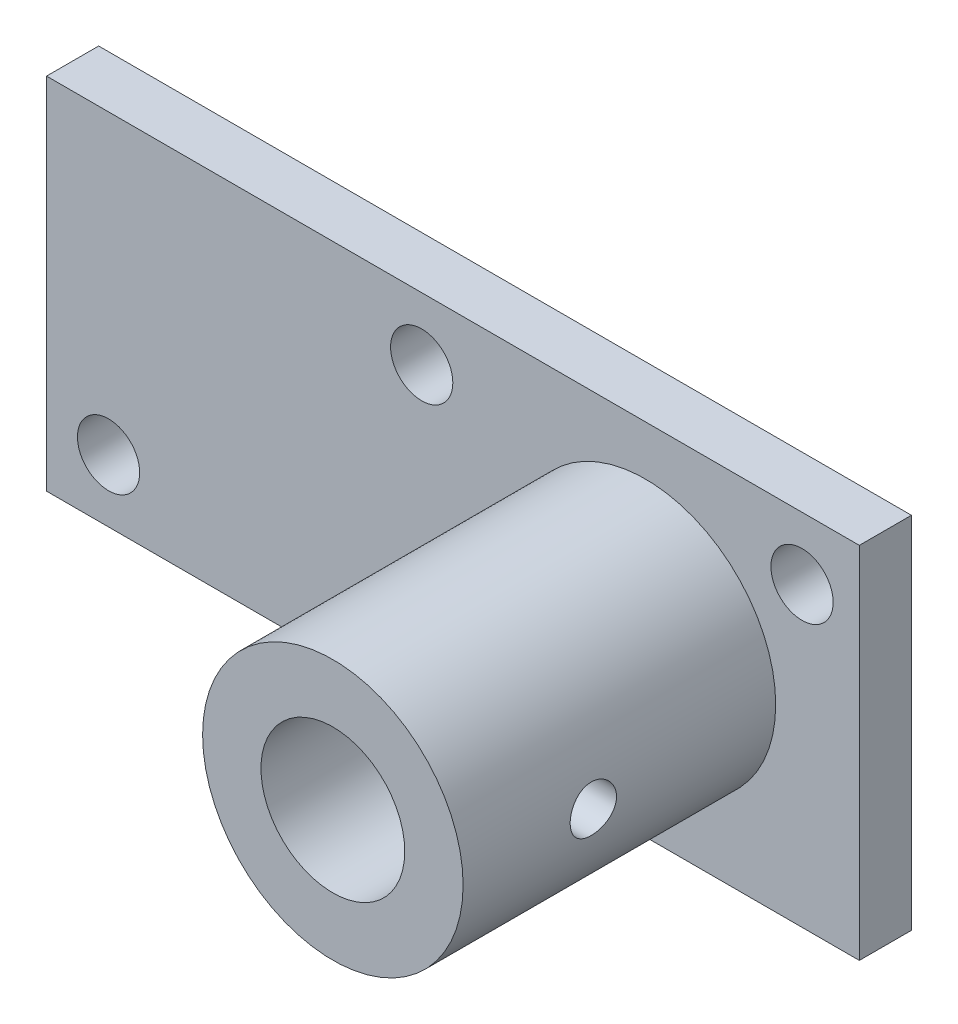
ISO-10303-21;
HEADER;
FILE_DESCRIPTION(('STEP AP214'),'2;1');
FILE_NAME('part.step','',(''),(''),'','','');
FILE_SCHEMA(('AUTOMOTIVE_DESIGN { 1 0 10303 214 1 1 1 1 }'));
ENDSEC;
DATA;
#1=APPLICATION_CONTEXT('core data for automotive mechanical design processes');
#2=APPLICATION_PROTOCOL_DEFINITION('international standard','automotive_design',2000,#1);
#3=PRODUCT_CONTEXT('',#1,'mechanical');
#4=PRODUCT('Part','Part','',(#3));
#5=PRODUCT_RELATED_PRODUCT_CATEGORY('part','',(#4));
#6=PRODUCT_DEFINITION_FORMATION('','',#4);
#7=PRODUCT_DEFINITION_CONTEXT('part definition',#1,'design');
#8=PRODUCT_DEFINITION('design','',#6,#7);
#9=PRODUCT_DEFINITION_SHAPE('','',#8);
#10=(LENGTH_UNIT() NAMED_UNIT(*) SI_UNIT(.MILLI.,.METRE.));
#11=(NAMED_UNIT(*) PLANE_ANGLE_UNIT() SI_UNIT($,.RADIAN.));
#12=(NAMED_UNIT(*) SI_UNIT($,.STERADIAN.) SOLID_ANGLE_UNIT());
#13=UNCERTAINTY_MEASURE_WITH_UNIT(LENGTH_MEASURE(1.E-05),#10,'distance_accuracy_value','');
#14=(GEOMETRIC_REPRESENTATION_CONTEXT(3) GLOBAL_UNCERTAINTY_ASSIGNED_CONTEXT((#13)) GLOBAL_UNIT_ASSIGNED_CONTEXT((#10,
#11,#12)) REPRESENTATION_CONTEXT('',''));
#15=CARTESIAN_POINT('',(0.,0.,0.));
#16=DIRECTION('',(0.,0.,1.));
#17=DIRECTION('',(1.,0.,0.));
#18=AXIS2_PLACEMENT_3D('',#15,#16,#17);
#19=CARTESIAN_POINT('',(0.,0.,2.54));
#20=DIRECTION('',(1.,0.,0.));
#21=DIRECTION('',(0.,1.,0.));
#22=AXIS2_PLACEMENT_3D('',#19,#20,#21);
#23=PLANE('',#22);
#24=DIRECTION('',(0.,-1.,0.));
#25=VECTOR('',#24,1.);
#26=CARTESIAN_POINT('',(0.,0.,0.));
#27=LINE('',#26,#25);
#28=CARTESIAN_POINT('',(0.,0.,0.));
#29=VERTEX_POINT('',#28);
#30=CARTESIAN_POINT('',(0.,-17.526,0.));
#31=VERTEX_POINT('',#30);
#32=EDGE_CURVE('E106',#29,#31,#27,.T.);
#33=ORIENTED_EDGE('',*,*,#32,.T.);
#34=DIRECTION('',(0.,0.,-1.));
#35=VECTOR('',#34,1.);
#36=CARTESIAN_POINT('',(0.,-17.526,2.54));
#37=LINE('',#36,#35);
#38=CARTESIAN_POINT('',(0.,-17.526,2.54));
#39=VERTEX_POINT('',#38);
#40=EDGE_CURVE('E11',#39,#31,#37,.T.);
#41=ORIENTED_EDGE('',*,*,#40,.F.);
#42=DIRECTION('',(0.,-1.,0.));
#43=VECTOR('',#42,1.);
#44=CARTESIAN_POINT('',(0.,0.,2.54));
#45=LINE('',#44,#43);
#46=CARTESIAN_POINT('',(0.,0.,2.54));
#47=VERTEX_POINT('',#46);
#48=EDGE_CURVE('E90',#47,#39,#45,.T.);
#49=ORIENTED_EDGE('',*,*,#48,.F.);
#50=DIRECTION('',(0.,0.,-1.));
#51=VECTOR('',#50,1.);
#52=CARTESIAN_POINT('',(0.,0.,2.54));
#53=LINE('',#52,#51);
#54=EDGE_CURVE('E102',#47,#29,#53,.T.);
#55=ORIENTED_EDGE('',*,*,#54,.T.);
#56=EDGE_LOOP('',(#33,#41,#49,#55));
#57=FACE_BOUND('',#56,.T.);
#58=ADVANCED_FACE('F38',(#57),#23,.F.);
#59=CARTESIAN_POINT('',(0.,-17.526,2.54));
#60=DIRECTION('',(0.,1.,0.));
#61=DIRECTION('',(0.,0.,1.));
#62=AXIS2_PLACEMENT_3D('',#59,#60,#61);
#63=PLANE('',#62);
#64=DIRECTION('',(1.,0.,0.));
#65=VECTOR('',#64,1.);
#66=CARTESIAN_POINT('',(0.,-17.526,0.));
#67=LINE('',#66,#65);
#68=CARTESIAN_POINT('',(39.624,-17.526,0.));
#69=VERTEX_POINT('',#68);
#70=EDGE_CURVE('E95',#31,#69,#67,.T.);
#71=ORIENTED_EDGE('',*,*,#70,.T.);
#72=DIRECTION('',(0.,0.,-1.));
#73=VECTOR('',#72,1.);
#74=CARTESIAN_POINT('',(39.624,-17.526,2.54));
#75=LINE('',#74,#73);
#76=CARTESIAN_POINT('',(39.624,-17.526,2.54));
#77=VERTEX_POINT('',#76);
#78=EDGE_CURVE('E47',#77,#69,#75,.T.);
#79=ORIENTED_EDGE('',*,*,#78,.F.);
#80=DIRECTION('',(1.,0.,0.));
#81=VECTOR('',#80,1.);
#82=CARTESIAN_POINT('',(0.,-17.526,2.54));
#83=LINE('',#82,#81);
#84=EDGE_CURVE('E85',#39,#77,#83,.T.);
#85=ORIENTED_EDGE('',*,*,#84,.F.);
#86=ORIENTED_EDGE('',*,*,#40,.T.);
#87=EDGE_LOOP('',(#71,#79,#85,#86));
#88=FACE_BOUND('',#87,.T.);
#89=ADVANCED_FACE('F94',(#88),#63,.F.);
#90=CARTESIAN_POINT('',(39.624,0.,2.54));
#91=DIRECTION('',(-1.,0.,0.));
#92=DIRECTION('',(0.,0.,1.));
#93=AXIS2_PLACEMENT_3D('',#90,#91,#92);
#94=PLANE('',#93);
#95=DIRECTION('',(0.,1.,0.));
#96=VECTOR('',#95,1.);
#97=CARTESIAN_POINT('',(39.624,0.,0.));
#98=LINE('',#97,#96);
#99=CARTESIAN_POINT('',(39.624,0.,0.));
#100=VERTEX_POINT('',#99);
#101=EDGE_CURVE('E72',#69,#100,#98,.T.);
#102=ORIENTED_EDGE('',*,*,#101,.T.);
#103=DIRECTION('',(0.,0.,-1.));
#104=VECTOR('',#103,1.);
#105=CARTESIAN_POINT('',(39.624,0.,2.54));
#106=LINE('',#105,#104);
#107=CARTESIAN_POINT('',(39.624,0.,2.54));
#108=VERTEX_POINT('',#107);
#109=EDGE_CURVE('E97',#108,#100,#106,.T.);
#110=ORIENTED_EDGE('',*,*,#109,.F.);
#111=DIRECTION('',(0.,1.,0.));
#112=VECTOR('',#111,1.);
#113=CARTESIAN_POINT('',(39.624,0.,2.54));
#114=LINE('',#113,#112);
#115=EDGE_CURVE('E88',#77,#108,#114,.T.);
#116=ORIENTED_EDGE('',*,*,#115,.F.);
#117=ORIENTED_EDGE('',*,*,#78,.T.);
#118=EDGE_LOOP('',(#102,#110,#116,#117));
#119=FACE_BOUND('',#118,.T.);
#120=ADVANCED_FACE('F98',(#119),#94,.F.);
#121=CARTESIAN_POINT('',(0.,0.,2.54));
#122=DIRECTION('',(0.,-1.,0.));
#123=DIRECTION('',(0.,0.,-1.));
#124=AXIS2_PLACEMENT_3D('',#121,#122,#123);
#125=PLANE('',#124);
#126=DIRECTION('',(-1.,0.,0.));
#127=VECTOR('',#126,1.);
#128=CARTESIAN_POINT('',(0.,0.,0.));
#129=LINE('',#128,#127);
#130=EDGE_CURVE('E78',#100,#29,#129,.T.);
#131=ORIENTED_EDGE('',*,*,#130,.T.);
#132=ORIENTED_EDGE('',*,*,#54,.F.);
#133=DIRECTION('',(-1.,0.,0.));
#134=VECTOR('',#133,1.);
#135=CARTESIAN_POINT('',(0.,0.,2.54));
#136=LINE('',#135,#134);
#137=EDGE_CURVE('E55',#108,#47,#136,.T.);
#138=ORIENTED_EDGE('',*,*,#137,.F.);
#139=ORIENTED_EDGE('',*,*,#109,.T.);
#140=EDGE_LOOP('',(#131,#132,#138,#139));
#141=FACE_BOUND('',#140,.T.);
#142=ADVANCED_FACE('F120',(#141),#125,.F.);
#143=CARTESIAN_POINT('',(0.,0.,2.54));
#144=DIRECTION('',(0.,0.,1.));
#145=DIRECTION('',(1.,0.,0.));
#146=AXIS2_PLACEMENT_3D('',#143,#144,#145);
#147=PLANE('',#146);
#148=CARTESIAN_POINT('',(29.1973,-8.763,2.54));
#149=DIRECTION('',(0.,0.,1.));
#150=DIRECTION('',(1.,0.,0.));
#151=AXIS2_PLACEMENT_3D('',#148,#149,#150);
#152=CIRCLE('',#151,6.35);
#153=CARTESIAN_POINT('',(35.5473,-8.763,2.54));
#154=VERTEX_POINT('',#153);
#155=EDGE_CURVE('E159',#154,#154,#152,.T.);
#156=ORIENTED_EDGE('',*,*,#155,.F.);
#157=EDGE_LOOP('',(#156));
#158=FACE_BOUND('',#157,.T.);
#159=CARTESIAN_POINT('',(36.83,-3.048,2.54));
#160=DIRECTION('',(0.,0.,1.));
#161=DIRECTION('',(1.,0.,0.));
#162=AXIS2_PLACEMENT_3D('',#159,#160,#161);
#163=CIRCLE('',#162,1.51789784471177);
#164=CARTESIAN_POINT('',(38.3478978447118,-3.048,2.54));
#165=VERTEX_POINT('',#164);
#166=EDGE_CURVE('E152',#165,#165,#163,.T.);
#167=ORIENTED_EDGE('',*,*,#166,.F.);
#168=EDGE_LOOP('',(#167));
#169=FACE_BOUND('',#168,.T.);
#170=CARTESIAN_POINT('',(21.5646,-14.478,2.54));
#171=DIRECTION('',(0.,0.,1.));
#172=DIRECTION('',(1.,0.,0.));
#173=AXIS2_PLACEMENT_3D('',#170,#171,#172);
#174=CIRCLE('',#173,1.51789784471177);
#175=CARTESIAN_POINT('',(23.0824978447118,-14.478,2.54));
#176=VERTEX_POINT('',#175);
#177=EDGE_CURVE('E144',#176,#176,#174,.T.);
#178=ORIENTED_EDGE('',*,*,#177,.F.);
#179=EDGE_LOOP('',(#178));
#180=FACE_BOUND('',#179,.T.);
#181=CARTESIAN_POINT('',(18.288,-3.048,2.54));
#182=DIRECTION('',(0.,0.,1.));
#183=DIRECTION('',(1.,0.,0.));
#184=AXIS2_PLACEMENT_3D('',#181,#182,#183);
#185=CIRCLE('',#184,1.51789784471177);
#186=CARTESIAN_POINT('',(19.8058978447118,-3.048,2.54));
#187=VERTEX_POINT('',#186);
#188=EDGE_CURVE('E136',#187,#187,#185,.T.);
#189=ORIENTED_EDGE('',*,*,#188,.F.);
#190=EDGE_LOOP('',(#189));
#191=FACE_BOUND('',#190,.T.);
#192=CARTESIAN_POINT('',(3.0226,-14.478,2.54));
#193=DIRECTION('',(0.,0.,1.));
#194=DIRECTION('',(1.,0.,0.));
#195=AXIS2_PLACEMENT_3D('',#192,#193,#194);
#196=CIRCLE('',#195,1.51789784471177);
#197=CARTESIAN_POINT('',(4.54049784471178,-14.478,2.54));
#198=VERTEX_POINT('',#197);
#199=EDGE_CURVE('E127',#198,#198,#196,.T.);
#200=ORIENTED_EDGE('',*,*,#199,.F.);
#201=EDGE_LOOP('',(#200));
#202=FACE_BOUND('',#201,.T.);
#203=ORIENTED_EDGE('',*,*,#48,.T.);
#204=ORIENTED_EDGE('',*,*,#84,.T.);
#205=ORIENTED_EDGE('',*,*,#115,.T.);
#206=ORIENTED_EDGE('',*,*,#137,.T.);
#207=EDGE_LOOP('',(#203,#204,#205,#206));
#208=FACE_BOUND('',#207,.T.);
#209=ADVANCED_FACE('F86',(#158,#169,#180,#191,#202,#208),#147,.T.);
#210=CARTESIAN_POINT('',(0.,0.,0.));
#211=DIRECTION('',(0.,0.,1.));
#212=DIRECTION('',(1.,0.,0.));
#213=AXIS2_PLACEMENT_3D('',#210,#211,#212);
#214=PLANE('',#213);
#215=CARTESIAN_POINT('',(33.274,-14.224,0.));
#216=DIRECTION('',(0.,0.,-1.));
#217=DIRECTION('',(-1.,0.,0.));
#218=AXIS2_PLACEMENT_3D('',#215,#216,#217);
#219=CIRCLE('',#218,2.38125);
#220=CARTESIAN_POINT('',(30.89275,-14.224,0.));
#221=VERTEX_POINT('',#220);
#222=EDGE_CURVE('E402',#221,#221,#219,.T.);
#223=ORIENTED_EDGE('',*,*,#222,.F.);
#224=EDGE_LOOP('',(#223));
#225=FACE_BOUND('',#224,.T.);
#226=CARTESIAN_POINT('',(23.368,-3.55599999999999,0.));
#227=DIRECTION('',(0.,0.,-1.));
#228=DIRECTION('',(-1.,0.,0.));
#229=AXIS2_PLACEMENT_3D('',#226,#227,#228);
#230=CIRCLE('',#229,2.38125);
#231=CARTESIAN_POINT('',(20.98675,-3.55599999999999,0.));
#232=VERTEX_POINT('',#231);
#233=EDGE_CURVE('E401',#232,#232,#230,.T.);
#234=ORIENTED_EDGE('',*,*,#233,.F.);
#235=EDGE_LOOP('',(#234));
#236=FACE_BOUND('',#235,.T.);
#237=CARTESIAN_POINT('',(5.715,-3.55599999999999,0.));
#238=DIRECTION('',(0.,0.,-1.));
#239=DIRECTION('',(-1.,0.,0.));
#240=AXIS2_PLACEMENT_3D('',#237,#238,#239);
#241=CIRCLE('',#240,2.38125);
#242=CARTESIAN_POINT('',(3.33375,-3.55599999999999,0.));
#243=VERTEX_POINT('',#242);
#244=EDGE_CURVE('E424',#243,#243,#241,.T.);
#245=ORIENTED_EDGE('',*,*,#244,.F.);
#246=EDGE_LOOP('',(#245));
#247=FACE_BOUND('',#246,.T.);
#248=CARTESIAN_POINT('',(15.748,-14.224,0.));
#249=DIRECTION('',(0.,0.,-1.));
#250=DIRECTION('',(-1.,0.,0.));
#251=AXIS2_PLACEMENT_3D('',#248,#249,#250);
#252=CIRCLE('',#251,2.38125);
#253=CARTESIAN_POINT('',(13.36675,-14.224,0.));
#254=VERTEX_POINT('',#253);
#255=EDGE_CURVE('E416',#254,#254,#252,.T.);
#256=ORIENTED_EDGE('',*,*,#255,.F.);
#257=EDGE_LOOP('',(#256));
#258=FACE_BOUND('',#257,.T.);
#259=CARTESIAN_POINT('',(29.1973,-8.763,0.));
#260=DIRECTION('',(0.,0.,1.));
#261=DIRECTION('',(1.,0.,0.));
#262=AXIS2_PLACEMENT_3D('',#259,#260,#261);
#263=CIRCLE('',#262,3.5052);
#264=CARTESIAN_POINT('',(32.7025,-8.763,0.));
#265=VERTEX_POINT('',#264);
#266=EDGE_CURVE('E163',#265,#265,#263,.T.);
#267=ORIENTED_EDGE('',*,*,#266,.T.);
#268=EDGE_LOOP('',(#267));
#269=FACE_BOUND('',#268,.T.);
#270=CARTESIAN_POINT('',(36.83,-3.048,0.));
#271=DIRECTION('',(0.,0.,1.));
#272=DIRECTION('',(1.,0.,0.));
#273=AXIS2_PLACEMENT_3D('',#270,#271,#272);
#274=CIRCLE('',#273,1.51789784471177);
#275=CARTESIAN_POINT('',(38.3478978447118,-3.048,0.));
#276=VERTEX_POINT('',#275);
#277=EDGE_CURVE('E110',#276,#276,#274,.T.);
#278=ORIENTED_EDGE('',*,*,#277,.T.);
#279=EDGE_LOOP('',(#278));
#280=FACE_BOUND('',#279,.T.);
#281=CARTESIAN_POINT('',(21.5646,-14.478,0.));
#282=DIRECTION('',(0.,0.,1.));
#283=DIRECTION('',(1.,0.,0.));
#284=AXIS2_PLACEMENT_3D('',#281,#282,#283);
#285=CIRCLE('',#284,1.51789784471177);
#286=CARTESIAN_POINT('',(23.0824978447118,-14.478,0.));
#287=VERTEX_POINT('',#286);
#288=EDGE_CURVE('E148',#287,#287,#285,.T.);
#289=ORIENTED_EDGE('',*,*,#288,.T.);
#290=EDGE_LOOP('',(#289));
#291=FACE_BOUND('',#290,.T.);
#292=CARTESIAN_POINT('',(18.288,-3.048,0.));
#293=DIRECTION('',(0.,0.,1.));
#294=DIRECTION('',(1.,0.,0.));
#295=AXIS2_PLACEMENT_3D('',#292,#293,#294);
#296=CIRCLE('',#295,1.51789784471177);
#297=CARTESIAN_POINT('',(19.8058978447118,-3.048,0.));
#298=VERTEX_POINT('',#297);
#299=EDGE_CURVE('E140',#298,#298,#296,.T.);
#300=ORIENTED_EDGE('',*,*,#299,.T.);
#301=EDGE_LOOP('',(#300));
#302=FACE_BOUND('',#301,.T.);
#303=CARTESIAN_POINT('',(3.0226,-14.478,0.));
#304=DIRECTION('',(0.,0.,1.));
#305=DIRECTION('',(1.,0.,0.));
#306=AXIS2_PLACEMENT_3D('',#303,#304,#305);
#307=CIRCLE('',#306,1.51789784471177);
#308=CARTESIAN_POINT('',(4.54049784471178,-14.478,0.));
#309=VERTEX_POINT('',#308);
#310=EDGE_CURVE('E131',#309,#309,#307,.T.);
#311=ORIENTED_EDGE('',*,*,#310,.T.);
#312=EDGE_LOOP('',(#311));
#313=FACE_BOUND('',#312,.T.);
#314=ORIENTED_EDGE('',*,*,#32,.F.);
#315=ORIENTED_EDGE('',*,*,#130,.F.);
#316=ORIENTED_EDGE('',*,*,#101,.F.);
#317=ORIENTED_EDGE('',*,*,#70,.F.);
#318=EDGE_LOOP('',(#314,#315,#316,#317));
#319=FACE_BOUND('',#318,.T.);
#320=ADVANCED_FACE('F123',(#225,#236,#247,#258,#269,#280,#291,#302,#313,#319),#214,.F.);
#321=CARTESIAN_POINT('',(3.0226,-14.478,0.));
#322=DIRECTION('',(0.,0.,1.));
#323=DIRECTION('',(1.,0.,0.));
#324=AXIS2_PLACEMENT_3D('',#321,#322,#323);
#325=CYLINDRICAL_SURFACE('',#324,1.51789784471177);
#326=ORIENTED_EDGE('',*,*,#310,.F.);
#327=EDGE_LOOP('',(#326));
#328=FACE_BOUND('',#327,.T.);
#329=ORIENTED_EDGE('',*,*,#199,.T.);
#330=EDGE_LOOP('',(#329));
#331=FACE_BOUND('',#330,.T.);
#332=ADVANCED_FACE('F216',(#328,#331),#325,.F.);
#333=CARTESIAN_POINT('',(18.288,-3.048,0.));
#334=DIRECTION('',(0.,0.,1.));
#335=DIRECTION('',(1.,0.,0.));
#336=AXIS2_PLACEMENT_3D('',#333,#334,#335);
#337=CYLINDRICAL_SURFACE('',#336,1.51789784471177);
#338=ORIENTED_EDGE('',*,*,#299,.F.);
#339=EDGE_LOOP('',(#338));
#340=FACE_BOUND('',#339,.T.);
#341=ORIENTED_EDGE('',*,*,#188,.T.);
#342=EDGE_LOOP('',(#341));
#343=FACE_BOUND('',#342,.T.);
#344=ADVANCED_FACE('F212',(#340,#343),#337,.F.);
#345=CARTESIAN_POINT('',(21.5646,-14.478,0.));
#346=DIRECTION('',(0.,0.,1.));
#347=DIRECTION('',(1.,0.,0.));
#348=AXIS2_PLACEMENT_3D('',#345,#346,#347);
#349=CYLINDRICAL_SURFACE('',#348,1.51789784471177);
#350=ORIENTED_EDGE('',*,*,#288,.F.);
#351=EDGE_LOOP('',(#350));
#352=FACE_BOUND('',#351,.T.);
#353=ORIENTED_EDGE('',*,*,#177,.T.);
#354=EDGE_LOOP('',(#353));
#355=FACE_BOUND('',#354,.T.);
#356=ADVANCED_FACE('F208',(#352,#355),#349,.F.);
#357=CARTESIAN_POINT('',(36.83,-3.048,0.));
#358=DIRECTION('',(0.,0.,1.));
#359=DIRECTION('',(1.,0.,0.));
#360=AXIS2_PLACEMENT_3D('',#357,#358,#359);
#361=CYLINDRICAL_SURFACE('',#360,1.51789784471177);
#362=ORIENTED_EDGE('',*,*,#277,.F.);
#363=EDGE_LOOP('',(#362));
#364=FACE_BOUND('',#363,.T.);
#365=ORIENTED_EDGE('',*,*,#166,.T.);
#366=EDGE_LOOP('',(#365));
#367=FACE_BOUND('',#366,.T.);
#368=ADVANCED_FACE('F204',(#364,#367),#361,.F.);
#369=CARTESIAN_POINT('',(29.1973,-8.763,17.78));
#370=DIRECTION('',(0.,0.,-1.));
#371=DIRECTION('',(-1.,0.,0.));
#372=AXIS2_PLACEMENT_3D('',#369,#370,#371);
#373=CYLINDRICAL_SURFACE('',#372,6.35);
#374=CARTESIAN_POINT('',(35.5473,-8.763,10.2997));
#375=CARTESIAN_POINT('',(35.5472988839214,-8.70004361212089,10.2997024641412));
#376=CARTESIAN_POINT('',(35.5463540312845,-8.63705448181991,10.3049776681979));
#377=CARTESIAN_POINT('',(35.5426758553173,-8.51284729791813,10.325927785077));
#378=CARTESIAN_POINT('',(35.5399409590206,-8.45163085147919,10.3416118446503));
#379=CARTESIAN_POINT('',(35.5329890155426,-8.33278364662527,10.382887439373));
#380=CARTESIAN_POINT('',(35.5287732482168,-8.27514984234361,10.4084704212254));
#381=CARTESIAN_POINT('',(35.5193214099674,-8.16499890882843,10.4687942395897));
#382=CARTESIAN_POINT('',(35.5140854375703,-8.11248128623259,10.5035341918794));
#383=CARTESIAN_POINT('',(35.5031088163252,-8.01347778351287,10.58158606018));
#384=CARTESIAN_POINT('',(35.4973637611231,-7.96705541644273,10.6249779269824));
#385=CARTESIAN_POINT('',(35.4860496576056,-7.88210925720371,10.7189298435214));
#386=CARTESIAN_POINT('',(35.4804806212128,-7.8435859991152,10.7694903775606));
#387=CARTESIAN_POINT('',(35.4701063648956,-7.77527191752665,10.8767874026684));
#388=CARTESIAN_POINT('',(35.4653068328625,-7.74554486076995,10.9335650910238));
#389=CARTESIAN_POINT('',(35.4570766722081,-7.69607502625849,11.0514081066579));
#390=CARTESIAN_POINT('',(35.453645937668,-7.67633147593894,11.1124731017506));
#391=CARTESIAN_POINT('',(35.4485859511231,-7.64759120648765,11.2364806221497));
#392=CARTESIAN_POINT('',(35.4469382305239,-7.63848423299088,11.2993968264517));
#393=CARTESIAN_POINT('',(35.4455750697441,-7.63093358350759,11.4258841726389));
#394=CARTESIAN_POINT('',(35.4458594735451,-7.63248904653243,11.4894552612283));
#395=CARTESIAN_POINT('',(35.4483115898171,-7.64612952520526,11.6146545925669));
#396=CARTESIAN_POINT('',(35.4504570058599,-7.65808988666936,11.6762969171495));
#397=CARTESIAN_POINT('',(35.4563544484031,-7.69200466261428,11.7966858147278));
#398=CARTESIAN_POINT('',(35.4601065370222,-7.71395946351099,11.8554322756631));
#399=CARTESIAN_POINT('',(35.4688182331776,-7.76736390291423,11.9687305440266));
#400=CARTESIAN_POINT('',(35.4737842987469,-7.79886454494714,12.0232577933252));
#401=CARTESIAN_POINT('',(35.4843600311292,-7.87043034305935,12.1262996839654));
#402=CARTESIAN_POINT('',(35.4899697569748,-7.91049628498496,12.1748137729679));
#403=CARTESIAN_POINT('',(35.5012982759432,-7.99873077784152,12.2651730646175));
#404=CARTESIAN_POINT('',(35.5070174881098,-8.04700610756028,12.3069140169538));
#405=CARTESIAN_POINT('',(35.5178473136864,-8.14992992190666,12.3817197140683));
#406=CARTESIAN_POINT('',(35.5229579220825,-8.20457845903249,12.4147843873699));
#407=CARTESIAN_POINT('',(35.5320035371058,-8.31880111535749,12.4713115248425));
#408=CARTESIAN_POINT('',(35.5359373092163,-8.37838032386335,12.4947639150777));
#409=CARTESIAN_POINT('',(35.5421763247662,-8.50071790774443,12.5312994409265));
#410=CARTESIAN_POINT('',(35.5444817238684,-8.56347597862407,12.5443835677003));
#411=CARTESIAN_POINT('',(35.5471830677014,-8.68949214914823,12.5596678304126));
#412=CARTESIAN_POINT('',(35.5476040922824,-8.7527323890874,12.5620109329397));
#413=CARTESIAN_POINT('',(35.5465582516325,-8.8787013486214,12.5561290288385));
#414=CARTESIAN_POINT('',(35.5450914696525,-8.94143009065015,12.5479044882357));
#415=CARTESIAN_POINT('',(35.5404503967875,-9.06414752277247,12.5212396575751));
#416=CARTESIAN_POINT('',(35.537288079341,-9.12415226452032,12.5028709758914));
#417=CARTESIAN_POINT('',(35.5296090400633,-9.24023053507357,12.4565162302778));
#418=CARTESIAN_POINT('',(35.5250922335436,-9.29630381779624,12.428529564973));
#419=CARTESIAN_POINT('',(35.5151427706813,-9.40354272101892,12.3634116999382));
#420=CARTESIAN_POINT('',(35.5097014432733,-9.45465391851603,12.3261922252926));
#421=CARTESIAN_POINT('',(35.4985305452476,-9.54995626008388,12.243785640016));
#422=CARTESIAN_POINT('',(35.4928009505733,-9.59414682534084,12.1985978636195));
#423=CARTESIAN_POINT('',(35.4816170581589,-9.67489052421384,12.1008929168132));
#424=CARTESIAN_POINT('',(35.4761668467511,-9.71134653713584,12.0482949418994));
#425=CARTESIAN_POINT('',(35.4662382046627,-9.77490558831821,11.9376375448361));
#426=CARTESIAN_POINT('',(35.4617597402094,-9.80200895164484,11.8795783125905));
#427=CARTESIAN_POINT('',(35.454313073442,-9.84595206493416,11.7599047805981));
#428=CARTESIAN_POINT('',(35.4513380670513,-9.86283812432205,11.6983079281452));
#429=CARTESIAN_POINT('',(35.4472188773124,-9.88601156564013,11.5730940845072));
#430=CARTESIAN_POINT('',(35.4460745099498,-9.89230001283748,11.5094772970202));
#431=CARTESIAN_POINT('',(35.4457548497901,-9.89406684825177,11.3830007842967));
#432=CARTESIAN_POINT('',(35.4465516813586,-9.8896982702158,11.3201432157054));
#433=CARTESIAN_POINT('',(35.4499631628282,-9.87060816297117,11.1960732439359));
#434=CARTESIAN_POINT('',(35.4525778043207,-9.85588668165289,11.134860833149));
#435=CARTESIAN_POINT('',(35.4593190957518,-9.81657047523371,11.0158902394755));
#436=CARTESIAN_POINT('',(35.46344345048,-9.79199073220675,10.9581269671203));
#437=CARTESIAN_POINT('',(35.472741343287,-9.7336719556696,10.8475194419059));
#438=CARTESIAN_POINT('',(35.4779149452372,-9.69993236452578,10.7946754887884));
#439=CARTESIAN_POINT('',(35.4888158029517,-9.62371293036598,10.694636922572));
#440=CARTESIAN_POINT('',(35.4945495961653,-9.58112112927667,10.647528309166));
#441=CARTESIAN_POINT('',(35.5058743780057,-9.48864113550803,10.5610751818433));
#442=CARTESIAN_POINT('',(35.5114653334781,-9.43875126660612,10.5217324564886));
#443=CARTESIAN_POINT('',(35.5219266689472,-9.33261488739934,10.4516367444014));
#444=CARTESIAN_POINT('',(35.5267909293315,-9.2763207362152,10.4209549615021));
#445=CARTESIAN_POINT('',(35.5351912214025,-9.15931076881733,10.369532318826));
#446=CARTESIAN_POINT('',(35.5387285355505,-9.09859928996921,10.3487818552909));
#447=CARTESIAN_POINT('',(35.5433311949866,-8.99190119283783,10.3221616032305));
#448=CARTESIAN_POINT('',(35.5448113052666,-8.94654900798498,10.3137524660716));
#449=CARTESIAN_POINT('',(35.5467961057955,-8.85513705168356,10.3025208222923));
#450=CARTESIAN_POINT('',(35.5473008168493,-8.80907729534834,10.299698196514));
#451=CARTESIAN_POINT('',(35.5473,-8.763,10.2997));
#452=B_SPLINE_CURVE_WITH_KNOTS('',3,(#374,#375,#376,#377,#378,#379,#380,#381,#382,#383,#384,
#385,#386,#387,#388,#389,#390,#391,#392,#393,#394,#395,#396,#397,#398,#399,#400,#401,#402,#403,
#404,#405,#406,#407,#408,#409,#410,#411,#412,#413,#414,#415,#416,#417,#418,#419,#420,#421,#422,
#423,#424,#425,#426,#427,#428,#429,#430,#431,#432,#433,#434,#435,#436,#437,#438,#439,#440,#441,
#442,#443,#444,#445,#446,#447,#448,#449,#450,#451),.UNSPECIFIED.,.T.,.F.,(4,2,2,2,2,2,2,2,2,2,2,
2,2,2,2,2,2,2,2,2,2,2,2,2,2,2,2,2,2,2,2,2,2,2,2,2,2,2,4),(0.,0.18870069508946,0.377567430304388,
0.566271335794911,0.754957026188639,0.945474674221985,1.13600519943006,1.32788488763883,
1.51974972513489,1.70960760659307,1.89945015726349,2.08704917225958,2.27465544102886,
2.46328231488541,2.65192650225097,2.84324403808117,3.03456314996841,3.22608225995458,
3.41758305935038,3.60652737403342,3.79546335669536,3.98308236329306,4.17071310310584,
4.36021202617096,4.54972678970792,4.7414962866967,4.93325911775944,5.12414615244473,
5.31501399810745,5.50315717677208,5.69129948513108,5.87915694151404,6.06702583685681,
6.25743369109016,6.44788534712726,6.63985995513201,6.83164854337843,6.96976007448543,
7.10786865969793),.UNSPECIFIED.);
#453=CARTESIAN_POINT('',(35.5473,-8.763,10.2997));
#454=VERTEX_POINT('',#453);
#455=EDGE_CURVE('E171',#454,#454,#452,.T.);
#456=ORIENTED_EDGE('',*,*,#455,.F.);
#457=EDGE_LOOP('',(#456));
#458=FACE_BOUND('',#457,.T.);
#459=CARTESIAN_POINT('',(29.1973,-8.763,17.78));
#460=DIRECTION('',(0.,0.,1.));
#461=DIRECTION('',(1.,0.,0.));
#462=AXIS2_PLACEMENT_3D('',#459,#460,#461);
#463=CIRCLE('',#462,6.35);
#464=CARTESIAN_POINT('',(35.5473,-8.763,17.78));
#465=VERTEX_POINT('',#464);
#466=EDGE_CURVE('E132',#465,#465,#463,.T.);
#467=ORIENTED_EDGE('',*,*,#466,.F.);
#468=EDGE_LOOP('',(#467));
#469=FACE_BOUND('',#468,.T.);
#470=ORIENTED_EDGE('',*,*,#155,.T.);
#471=EDGE_LOOP('',(#470));
#472=FACE_BOUND('',#471,.T.);
#473=ADVANCED_FACE('F200',(#458,#469,#472),#373,.T.);
#474=CARTESIAN_POINT('',(0.,0.,17.78));
#475=DIRECTION('',(0.,0.,1.));
#476=DIRECTION('',(1.,0.,0.));
#477=AXIS2_PLACEMENT_3D('',#474,#475,#476);
#478=PLANE('',#477);
#479=CARTESIAN_POINT('',(29.1973,-8.763,17.78));
#480=DIRECTION('',(0.,0.,1.));
#481=DIRECTION('',(1.,0.,0.));
#482=AXIS2_PLACEMENT_3D('',#479,#480,#481);
#483=CIRCLE('',#482,3.5052);
#484=CARTESIAN_POINT('',(32.7025,-8.763,17.78));
#485=VERTEX_POINT('',#484);
#486=EDGE_CURVE('E167',#485,#485,#483,.T.);
#487=ORIENTED_EDGE('',*,*,#486,.F.);
#488=EDGE_LOOP('',(#487));
#489=FACE_BOUND('',#488,.T.);
#490=ORIENTED_EDGE('',*,*,#466,.T.);
#491=EDGE_LOOP('',(#490));
#492=FACE_BOUND('',#491,.T.);
#493=ADVANCED_FACE('F196',(#489,#492),#478,.T.);
#494=CARTESIAN_POINT('',(29.1973,-8.763,0.));
#495=DIRECTION('',(0.,0.,1.));
#496=DIRECTION('',(1.,0.,0.));
#497=AXIS2_PLACEMENT_3D('',#494,#495,#496);
#498=CYLINDRICAL_SURFACE('',#497,3.5052);
#499=CARTESIAN_POINT('',(32.7025,-8.763,10.2997));
#500=CARTESIAN_POINT('',(32.7024999038775,-8.82478530226253,10.2997000919882));
#501=CARTESIAN_POINT('',(32.7008511348028,-8.88657203990903,10.3047826290449));
#502=CARTESIAN_POINT('',(32.6944358061772,-9.00833244064467,10.3249210129075));
#503=CARTESIAN_POINT('',(32.6896687225705,-9.06830579720898,10.3399785360887));
#504=CARTESIAN_POINT('',(32.6775362261762,-9.1846662701996,10.3795019056954));
#505=CARTESIAN_POINT('',(32.6701749894863,-9.24105897960692,10.4039526364949));
#506=CARTESIAN_POINT('',(32.6536101296368,-9.34894372089733,10.4615021486671));
#507=CARTESIAN_POINT('',(32.6444061808274,-9.4004348841871,10.4946024589371));
#508=CARTESIAN_POINT('',(32.6247927214997,-9.49873675444558,10.5696483306954));
#509=CARTESIAN_POINT('',(32.6143556986916,-9.54536506694358,10.6118255844125));
#510=CARTESIAN_POINT('',(32.5936079533665,-9.63102394976674,10.7033351184549));
#511=CARTESIAN_POINT('',(32.5832972567257,-9.67005298708492,10.7526688389637));
#512=CARTESIAN_POINT('',(32.5636708610617,-9.74041884490627,10.8586995193281));
#513=CARTESIAN_POINT('',(32.5543889193767,-9.77152346892127,10.9155574193248));
#514=CARTESIAN_POINT('',(32.5382868998666,-9.82365232906066,11.0340449319829));
#515=CARTESIAN_POINT('',(32.5314661256457,-9.84467941721214,11.0956731888516));
#516=CARTESIAN_POINT('',(32.5213473942791,-9.87538097060744,11.2198861068872));
#517=CARTESIAN_POINT('',(32.51794423584,-9.88539542299781,11.2823779179319));
#518=CARTESIAN_POINT('',(32.5147342499688,-9.89484994406083,11.408240304771));
#519=CARTESIAN_POINT('',(32.514926394512,-9.89429303545998,11.4716106241902));
#520=CARTESIAN_POINT('',(32.5187927582565,-9.88288564171521,11.5945782925172));
#521=CARTESIAN_POINT('',(32.5223189651377,-9.87247268499112,11.6542216784249));
#522=CARTESIAN_POINT('',(32.5322148674743,-9.84236022630315,11.7708649049396));
#523=CARTESIAN_POINT('',(32.5385848830335,-9.8226596788983,11.8278644471535));
#524=CARTESIAN_POINT('',(32.5535603143162,-9.77423300936042,11.9386214661458));
#525=CARTESIAN_POINT('',(32.5621984975499,-9.74537317215999,11.9923158568454));
#526=CARTESIAN_POINT('',(32.5807225519916,-9.67953998311209,12.0942407826475));
#527=CARTESIAN_POINT('',(32.5906087643621,-9.6425644106902,12.1424698168678));
#528=CARTESIAN_POINT('',(32.6111033429007,-9.5594238597837,12.2345615806866));
#529=CARTESIAN_POINT('',(32.6217234420833,-9.51289931130645,12.2780977075916));
#530=CARTESIAN_POINT('',(32.6420665836837,-9.41307802760466,12.3568320968113));
#531=CARTESIAN_POINT('',(32.6517895507152,-9.35978072415628,12.3920296588225));
#532=CARTESIAN_POINT('',(32.669356675856,-9.24726770150707,12.4533284809142));
#533=CARTESIAN_POINT('',(32.6771836236345,-9.18800421266766,12.4793473286962));
#534=CARTESIAN_POINT('',(32.6899522997187,-9.06562959831961,12.5209473704533));
#535=CARTESIAN_POINT('',(32.6948949632449,-9.0025197273276,12.5365319479513));
#536=CARTESIAN_POINT('',(32.7011855813925,-8.8770126212989,12.5562542480462));
#537=CARTESIAN_POINT('',(32.7026721795679,-8.81469165428618,12.5608337201879));
#538=CARTESIAN_POINT('',(32.7022959288642,-8.69016254536087,12.55966737814));
#539=CARTESIAN_POINT('',(32.7004336047228,-8.62795438730123,12.5539231815512));
#540=CARTESIAN_POINT('',(32.6936600833966,-8.50715083925963,12.5326248863689));
#541=CARTESIAN_POINT('',(32.6888318480597,-8.44850331509069,12.5173375439754));
#542=CARTESIAN_POINT('',(32.6766970842532,-8.33462524123529,12.4777161739741));
#543=CARTESIAN_POINT('',(32.669390244376,-8.27939512193698,12.4533810095771));
#544=CARTESIAN_POINT('',(32.6528148973119,-8.17236229748653,12.3956684059935));
#545=CARTESIAN_POINT('',(32.6435013957753,-8.1206818192517,12.3620775717844));
#546=CARTESIAN_POINT('',(32.6239736381092,-8.02354506941874,12.2870606090217));
#547=CARTESIAN_POINT('',(32.6137591233515,-7.97809059456169,12.2456322268358));
#548=CARTESIAN_POINT('',(32.5930341366256,-7.89269501231537,12.1540379740816));
#549=CARTESIAN_POINT('',(32.5825294562847,-7.8530690093557,12.1035763235369));
#550=CARTESIAN_POINT('',(32.5628605829849,-7.78281406145362,11.9964923656877));
#551=CARTESIAN_POINT('',(32.5536963826907,-7.75218506727706,11.9398700920982));
#552=CARTESIAN_POINT('',(32.5378428514719,-7.70096350707213,11.8221273454913));
#553=CARTESIAN_POINT('',(32.5311459206043,-7.68034005764961,11.7610213929539));
#554=CARTESIAN_POINT('',(32.5210605955639,-7.64975838278386,11.6359410860422));
#555=CARTESIAN_POINT('',(32.5176708354231,-7.63979575391362,11.5719679273458));
#556=CARTESIAN_POINT('',(32.5147321968931,-7.63114787370797,11.4462806744767));
#557=CARTESIAN_POINT('',(32.5150062972748,-7.63194288547945,11.3846060584206));
#558=CARTESIAN_POINT('',(32.5189308478867,-7.64352152106669,11.2623167192876));
#559=CARTESIAN_POINT('',(32.5225811208967,-7.65430462059282,11.2017019407485));
#560=CARTESIAN_POINT('',(32.532719129346,-7.68519576788357,11.0842486056532));
#561=CARTESIAN_POINT('',(32.5391587095166,-7.70514589458499,11.0273640385055));
#562=CARTESIAN_POINT('',(32.5541347994192,-7.75367887470118,10.9177048568082));
#563=CARTESIAN_POINT('',(32.5626717547431,-7.78226356284386,10.864931118755));
#564=CARTESIAN_POINT('',(32.5813202297852,-7.84863283466755,10.7626319565793));
#565=CARTESIAN_POINT('',(32.5914822007729,-7.88674848496291,10.7133305561495));
#566=CARTESIAN_POINT('',(32.6120136947414,-7.97052600058707,10.6216555035054));
#567=CARTESIAN_POINT('',(32.6223832740081,-8.01618993740753,10.5792837593786));
#568=CARTESIAN_POINT('',(32.6426043297936,-8.11572068762057,10.501156755027));
#569=CARTESIAN_POINT('',(32.6524242494108,-8.1698215342811,10.4656905153218));
#570=CARTESIAN_POINT('',(32.6700281136342,-8.28353229767566,10.4043992956875));
#571=CARTESIAN_POINT('',(32.6778127288863,-8.34314039095274,10.3785711387469));
#572=CARTESIAN_POINT('',(32.6900410882875,-8.462126742707,10.3387962200972));
#573=CARTESIAN_POINT('',(32.6946709439351,-8.52126208624401,10.3241795376806));
#574=CARTESIAN_POINT('',(32.7009000908687,-8.64126476258294,10.3046325210445));
#575=CARTESIAN_POINT('',(32.7025000946959,-8.70213168474466,10.299699909377));
#576=CARTESIAN_POINT('',(32.7025,-8.763,10.2997));
#577=B_SPLINE_CURVE_WITH_KNOTS('',3,(#499,#500,#501,#502,#503,#504,#505,#506,#507,#508,#509,
#510,#511,#512,#513,#514,#515,#516,#517,#518,#519,#520,#521,#522,#523,#524,#525,#526,#527,#528,
#529,#530,#531,#532,#533,#534,#535,#536,#537,#538,#539,#540,#541,#542,#543,#544,#545,#546,#547,
#548,#549,#550,#551,#552,#553,#554,#555,#556,#557,#558,#559,#560,#561,#562,#563,#564,#565,#566,
#567,#568,#569,#570,#571,#572,#573,#574,#575,#576),.UNSPECIFIED.,.T.,.F.,(4,2,2,2,2,2,2,2,2,2,2,
2,2,2,2,2,2,2,2,2,2,2,2,2,2,2,2,2,2,2,2,2,2,2,2,2,2,2,4),(0.,0.185132052168569,0.37029522514045,
0.55516167177399,0.740060817477997,0.93040276456378,1.12078306976825,1.31622687006828,
1.5116153254252,1.70078580070928,1.88990218627006,2.07099858157844,2.25211536654628,
2.43600830215275,2.61995161620491,2.81284443056541,3.0057534390375,3.20035288090856,
3.39488918937831,3.58147578581433,3.76803314881633,3.94959584305665,4.13118135696535,
4.31736568463961,4.50360362991598,4.69773053611106,4.89185637996959,5.08537915591677,
5.27882196684262,5.46295371703135,5.64707580241745,5.82813850379295,6.0092397056478,
6.19781687983399,6.38644589181909,6.5817856599226,6.77706098097216,6.95948830188323,
7.14187271537016),.UNSPECIFIED.);
#578=CARTESIAN_POINT('',(32.7025,-8.763,10.2997));
#579=VERTEX_POINT('',#578);
#580=EDGE_CURVE('E183',#579,#579,#577,.T.);
#581=ORIENTED_EDGE('',*,*,#580,.F.);
#582=EDGE_LOOP('',(#581));
#583=FACE_BOUND('',#582,.T.);
#584=ORIENTED_EDGE('',*,*,#266,.F.);
#585=EDGE_LOOP('',(#584));
#586=FACE_BOUND('',#585,.T.);
#587=ORIENTED_EDGE('',*,*,#486,.T.);
#588=EDGE_LOOP('',(#587));
#589=FACE_BOUND('',#588,.T.);
#590=ADVANCED_FACE('F193',(#583,#586,#589),#498,.F.);
#591=CARTESIAN_POINT('',(-0.001000000000001,-8.763,11.43));
#592=DIRECTION('',(1.,0.,0.));
#593=DIRECTION('',(0.,0.,-1.));
#594=AXIS2_PLACEMENT_3D('',#591,#592,#593);
#595=CYLINDRICAL_SURFACE('',#594,1.1303);
#596=ORIENTED_EDGE('',*,*,#580,.T.);
#597=EDGE_LOOP('',(#596));
#598=FACE_BOUND('',#597,.T.);
#599=ORIENTED_EDGE('',*,*,#455,.T.);
#600=EDGE_LOOP('',(#599));
#601=FACE_BOUND('',#600,.T.);
#602=ADVANCED_FACE('F189',(#598,#601),#595,.F.);
#603=CARTESIAN_POINT('',(15.748,-14.224,1.27));
#604=DIRECTION('',(0.,0.,-1.));
#605=DIRECTION('',(-1.,0.,0.));
#606=AXIS2_PLACEMENT_3D('',#603,#604,#605);
#607=CYLINDRICAL_SURFACE('',#606,2.38125);
#608=CARTESIAN_POINT('',(15.748,-14.224,1.27));
#609=DIRECTION('',(0.,0.,-1.));
#610=DIRECTION('',(-1.,0.,0.));
#611=AXIS2_PLACEMENT_3D('',#608,#609,#610);
#612=CIRCLE('',#611,2.38125);
#613=CARTESIAN_POINT('',(13.36675,-14.224,1.27));
#614=VERTEX_POINT('',#613);
#615=EDGE_CURVE('E413',#614,#614,#612,.T.);
#616=ORIENTED_EDGE('',*,*,#615,.F.);
#617=EDGE_LOOP('',(#616));
#618=FACE_BOUND('',#617,.T.);
#619=ORIENTED_EDGE('',*,*,#255,.T.);
#620=EDGE_LOOP('',(#619));
#621=FACE_BOUND('',#620,.T.);
#622=ADVANCED_FACE('F310',(#618,#621),#607,.F.);
#623=CARTESIAN_POINT('',(15.748,-14.224,1.27));
#624=DIRECTION('',(0.,0.,-1.));
#625=DIRECTION('',(-1.,0.,0.));
#626=AXIS2_PLACEMENT_3D('',#623,#624,#625);
#627=PLANE('',#626);
#628=ORIENTED_EDGE('',*,*,#615,.T.);
#629=EDGE_LOOP('',(#628));
#630=FACE_BOUND('',#629,.T.);
#631=ADVANCED_FACE('F322',(#630),#627,.T.);
#632=CARTESIAN_POINT('',(5.715,-3.55599999999999,1.27));
#633=DIRECTION('',(0.,0.,-1.));
#634=DIRECTION('',(-1.,0.,0.));
#635=AXIS2_PLACEMENT_3D('',#632,#633,#634);
#636=CYLINDRICAL_SURFACE('',#635,2.38125);
#637=CARTESIAN_POINT('',(5.715,-3.55599999999999,1.27));
#638=DIRECTION('',(0.,0.,-1.));
#639=DIRECTION('',(-1.,0.,0.));
#640=AXIS2_PLACEMENT_3D('',#637,#638,#639);
#641=CIRCLE('',#640,2.38125);
#642=CARTESIAN_POINT('',(3.33375,-3.55599999999999,1.27));
#643=VERTEX_POINT('',#642);
#644=EDGE_CURVE('E419',#643,#643,#641,.T.);
#645=ORIENTED_EDGE('',*,*,#644,.F.);
#646=EDGE_LOOP('',(#645));
#647=FACE_BOUND('',#646,.T.);
#648=ORIENTED_EDGE('',*,*,#244,.T.);
#649=EDGE_LOOP('',(#648));
#650=FACE_BOUND('',#649,.T.);
#651=ADVANCED_FACE('F332',(#647,#650),#636,.F.);
#652=CARTESIAN_POINT('',(5.715,-3.55599999999999,1.27));
#653=DIRECTION('',(0.,0.,-1.));
#654=DIRECTION('',(-1.,0.,0.));
#655=AXIS2_PLACEMENT_3D('',#652,#653,#654);
#656=PLANE('',#655);
#657=ORIENTED_EDGE('',*,*,#644,.T.);
#658=EDGE_LOOP('',(#657));
#659=FACE_BOUND('',#658,.T.);
#660=ADVANCED_FACE('F342',(#659),#656,.T.);
#661=CARTESIAN_POINT('',(23.368,-3.55599999999999,1.27));
#662=DIRECTION('',(0.,0.,-1.));
#663=DIRECTION('',(-1.,0.,0.));
#664=AXIS2_PLACEMENT_3D('',#661,#662,#663);
#665=CYLINDRICAL_SURFACE('',#664,2.38125);
#666=CARTESIAN_POINT('',(23.368,-3.55599999999999,1.27));
#667=DIRECTION('',(0.,0.,-1.));
#668=DIRECTION('',(-1.,0.,0.));
#669=AXIS2_PLACEMENT_3D('',#666,#667,#668);
#670=CIRCLE('',#669,2.38125);
#671=CARTESIAN_POINT('',(20.98675,-3.55599999999999,1.27));
#672=VERTEX_POINT('',#671);
#673=EDGE_CURVE('E407',#672,#672,#670,.T.);
#674=ORIENTED_EDGE('',*,*,#673,.F.);
#675=EDGE_LOOP('',(#674));
#676=FACE_BOUND('',#675,.T.);
#677=ORIENTED_EDGE('',*,*,#233,.T.);
#678=EDGE_LOOP('',(#677));
#679=FACE_BOUND('',#678,.T.);
#680=ADVANCED_FACE('F352',(#676,#679),#665,.F.);
#681=CARTESIAN_POINT('',(23.368,-3.55599999999999,1.27));
#682=DIRECTION('',(0.,0.,-1.));
#683=DIRECTION('',(-1.,0.,0.));
#684=AXIS2_PLACEMENT_3D('',#681,#682,#683);
#685=PLANE('',#684);
#686=ORIENTED_EDGE('',*,*,#673,.T.);
#687=EDGE_LOOP('',(#686));
#688=FACE_BOUND('',#687,.T.);
#689=ADVANCED_FACE('F362',(#688),#685,.T.);
#690=CARTESIAN_POINT('',(33.274,-14.224,1.27));
#691=DIRECTION('',(0.,0.,-1.));
#692=DIRECTION('',(-1.,0.,0.));
#693=AXIS2_PLACEMENT_3D('',#690,#691,#692);
#694=CYLINDRICAL_SURFACE('',#693,2.38125);
#695=CARTESIAN_POINT('',(33.274,-14.224,1.27));
#696=DIRECTION('',(0.,0.,-1.));
#697=DIRECTION('',(-1.,0.,0.));
#698=AXIS2_PLACEMENT_3D('',#695,#696,#697);
#699=CIRCLE('',#698,2.38125);
#700=CARTESIAN_POINT('',(30.89275,-14.224,1.27));
#701=VERTEX_POINT('',#700);
#702=EDGE_CURVE('E399',#701,#701,#699,.T.);
#703=ORIENTED_EDGE('',*,*,#702,.F.);
#704=EDGE_LOOP('',(#703));
#705=FACE_BOUND('',#704,.T.);
#706=ORIENTED_EDGE('',*,*,#222,.T.);
#707=EDGE_LOOP('',(#706));
#708=FACE_BOUND('',#707,.T.);
#709=ADVANCED_FACE('F372',(#705,#708),#694,.F.);
#710=CARTESIAN_POINT('',(33.274,-14.224,1.27));
#711=DIRECTION('',(0.,0.,-1.));
#712=DIRECTION('',(-1.,0.,0.));
#713=AXIS2_PLACEMENT_3D('',#710,#711,#712);
#714=PLANE('',#713);
#715=ORIENTED_EDGE('',*,*,#702,.T.);
#716=EDGE_LOOP('',(#715));
#717=FACE_BOUND('',#716,.T.);
#718=ADVANCED_FACE('F382',(#717),#714,.T.);
#719=CLOSED_SHELL('',(#58,#89,#120,#142,#209,#320,#332,#344,#356,#368,#473,#493,#590,#602,#622,
#631,#651,#660,#680,#689,#709,#718));
#720=MANIFOLD_SOLID_BREP('B2',#719);
#721=ADVANCED_BREP_SHAPE_REPRESENTATION('',(#18,#720),#14);
#722=SHAPE_DEFINITION_REPRESENTATION(#9,#721);
ENDSEC;
END-ISO-10303-21;
